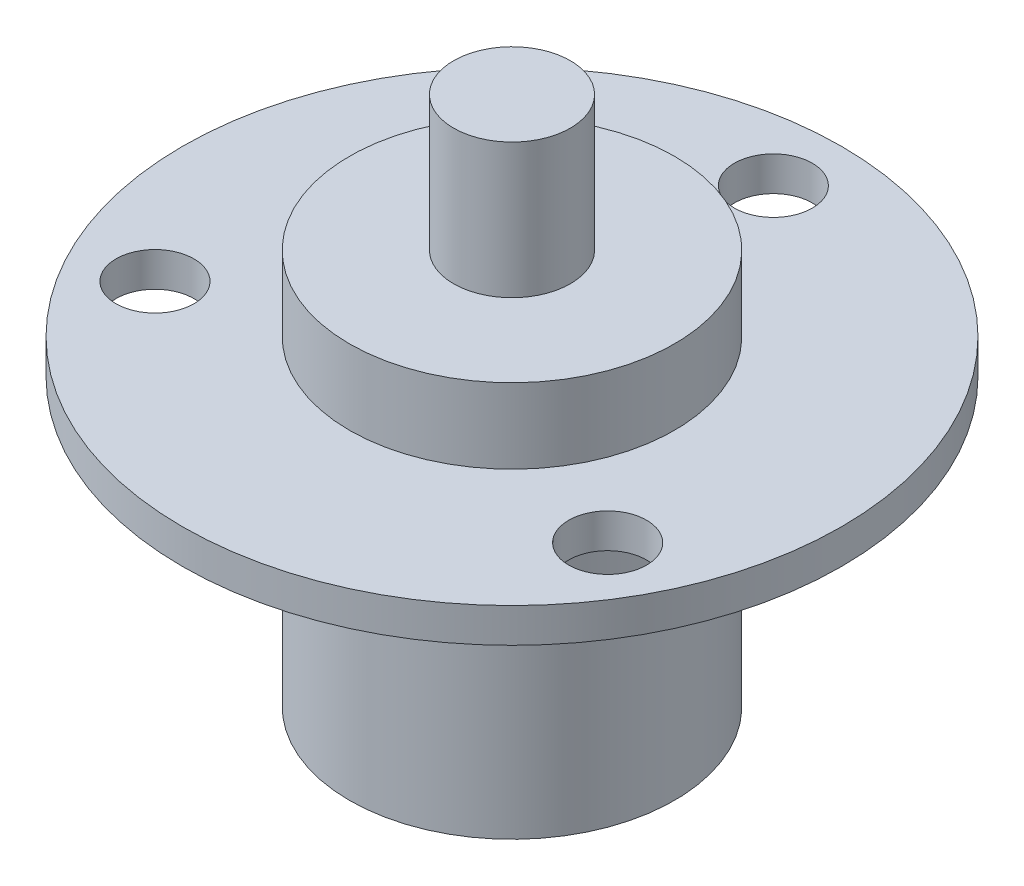
ISO-10303-21;
HEADER;
FILE_DESCRIPTION(('STEP AP214'),'2;1');
FILE_NAME('part.step','',(''),(''),'','','');
FILE_SCHEMA(('AUTOMOTIVE_DESIGN { 1 0 10303 214 1 1 1 1 }'));
ENDSEC;
DATA;
#1=APPLICATION_CONTEXT('core data for automotive mechanical design processes');
#2=APPLICATION_PROTOCOL_DEFINITION('international standard','automotive_design',2000,#1);
#3=PRODUCT_CONTEXT('',#1,'mechanical');
#4=PRODUCT('Part','Part','',(#3));
#5=PRODUCT_RELATED_PRODUCT_CATEGORY('part','',(#4));
#6=PRODUCT_DEFINITION_FORMATION('','',#4);
#7=PRODUCT_DEFINITION_CONTEXT('part definition',#1,'design');
#8=PRODUCT_DEFINITION('design','',#6,#7);
#9=PRODUCT_DEFINITION_SHAPE('','',#8);
#10=(LENGTH_UNIT() NAMED_UNIT(*) SI_UNIT(.MILLI.,.METRE.));
#11=(NAMED_UNIT(*) PLANE_ANGLE_UNIT() SI_UNIT($,.RADIAN.));
#12=(NAMED_UNIT(*) SI_UNIT($,.STERADIAN.) SOLID_ANGLE_UNIT());
#13=UNCERTAINTY_MEASURE_WITH_UNIT(LENGTH_MEASURE(1.E-05),#10,'distance_accuracy_value','');
#14=(GEOMETRIC_REPRESENTATION_CONTEXT(3) GLOBAL_UNCERTAINTY_ASSIGNED_CONTEXT((#13)) GLOBAL_UNIT_ASSIGNED_CONTEXT((#10,
#11,#12)) REPRESENTATION_CONTEXT('',''));
#15=CARTESIAN_POINT('',(0.,0.,0.));
#16=DIRECTION('',(0.,0.,1.));
#17=DIRECTION('',(1.,0.,0.));
#18=AXIS2_PLACEMENT_3D('',#15,#16,#17);
#19=CARTESIAN_POINT('',(0.,2.3,0.));
#20=DIRECTION('',(0.,-1.,0.));
#21=DIRECTION('',(0.,0.,-1.));
#22=AXIS2_PLACEMENT_3D('',#19,#20,#21);
#23=CYLINDRICAL_SURFACE('',#22,22.);
#24=CARTESIAN_POINT('',(0.,2.3,0.));
#25=DIRECTION('',(0.,1.,0.));
#26=DIRECTION('',(0.,0.,1.));
#27=AXIS2_PLACEMENT_3D('',#24,#25,#26);
#28=CIRCLE('',#27,22.);
#29=CARTESIAN_POINT('',(0.,2.3,22.));
#30=VERTEX_POINT('',#29);
#31=EDGE_CURVE('E51',#30,#30,#28,.T.);
#32=ORIENTED_EDGE('',*,*,#31,.F.);
#33=EDGE_LOOP('',(#32));
#34=FACE_BOUND('',#33,.T.);
#35=CARTESIAN_POINT('',(0.,0.,0.));
#36=DIRECTION('',(0.,1.,0.));
#37=DIRECTION('',(0.,0.,1.));
#38=AXIS2_PLACEMENT_3D('',#35,#36,#37);
#39=CIRCLE('',#38,22.);
#40=CARTESIAN_POINT('',(0.,0.,22.));
#41=VERTEX_POINT('',#40);
#42=EDGE_CURVE('E66',#41,#41,#39,.T.);
#43=ORIENTED_EDGE('',*,*,#42,.T.);
#44=EDGE_LOOP('',(#43));
#45=FACE_BOUND('',#44,.T.);
#46=ADVANCED_FACE('F39',(#34,#45),#23,.T.);
#47=CARTESIAN_POINT('',(0.,2.3,0.));
#48=DIRECTION('',(0.,1.,0.));
#49=DIRECTION('',(0.,0.,1.));
#50=AXIS2_PLACEMENT_3D('',#47,#48,#49);
#51=PLANE('',#50);
#52=CARTESIAN_POINT('',(-15.1121432960384,2.3,8.72500000000007));
#53=DIRECTION('',(0.,1.,0.));
#54=DIRECTION('',(0.,0.,1.));
#55=AXIS2_PLACEMENT_3D('',#52,#53,#54);
#56=CIRCLE('',#55,2.6);
#57=CARTESIAN_POINT('',(-15.1121432960384,2.3,11.3250000000001));
#58=VERTEX_POINT('',#57);
#59=EDGE_CURVE('E74',#58,#58,#56,.T.);
#60=ORIENTED_EDGE('',*,*,#59,.F.);
#61=EDGE_LOOP('',(#60));
#62=FACE_BOUND('',#61,.T.);
#63=CARTESIAN_POINT('',(15.1121432960384,2.3,8.72500000000007));
#64=DIRECTION('',(0.,1.,0.));
#65=DIRECTION('',(0.,0.,1.));
#66=AXIS2_PLACEMENT_3D('',#63,#64,#65);
#67=CIRCLE('',#66,2.6);
#68=CARTESIAN_POINT('',(15.1121432960384,2.3,11.3250000000001));
#69=VERTEX_POINT('',#68);
#70=EDGE_CURVE('E204',#69,#69,#67,.T.);
#71=ORIENTED_EDGE('',*,*,#70,.F.);
#72=EDGE_LOOP('',(#71));
#73=FACE_BOUND('',#72,.T.);
#74=CARTESIAN_POINT('',(0.,2.3,-17.45));
#75=DIRECTION('',(0.,1.,0.));
#76=DIRECTION('',(0.,0.,1.));
#77=AXIS2_PLACEMENT_3D('',#74,#75,#76);
#78=CIRCLE('',#77,2.6);
#79=CARTESIAN_POINT('',(0.,2.3,-14.85));
#80=VERTEX_POINT('',#79);
#81=EDGE_CURVE('E207',#80,#80,#78,.T.);
#82=ORIENTED_EDGE('',*,*,#81,.F.);
#83=EDGE_LOOP('',(#82));
#84=FACE_BOUND('',#83,.T.);
#85=CARTESIAN_POINT('',(0.,2.3,0.));
#86=DIRECTION('',(0.,1.,0.));
#87=DIRECTION('',(0.,0.,1.));
#88=AXIS2_PLACEMENT_3D('',#85,#86,#87);
#89=CIRCLE('',#88,10.85);
#90=CARTESIAN_POINT('',(0.,2.3,10.85));
#91=VERTEX_POINT('',#90);
#92=EDGE_CURVE('E46',#91,#91,#89,.T.);
#93=ORIENTED_EDGE('',*,*,#92,.F.);
#94=EDGE_LOOP('',(#93));
#95=FACE_BOUND('',#94,.T.);
#96=ORIENTED_EDGE('',*,*,#31,.T.);
#97=EDGE_LOOP('',(#96));
#98=FACE_BOUND('',#97,.T.);
#99=ADVANCED_FACE('F100',(#62,#73,#84,#95,#98),#51,.T.);
#100=CARTESIAN_POINT('',(0.,0.,0.));
#101=DIRECTION('',(0.,1.,0.));
#102=DIRECTION('',(0.,0.,1.));
#103=AXIS2_PLACEMENT_3D('',#100,#101,#102);
#104=PLANE('',#103);
#105=CARTESIAN_POINT('',(-15.1121432960384,0.,8.72500000000007));
#106=DIRECTION('',(0.,1.,0.));
#107=DIRECTION('',(0.,0.,1.));
#108=AXIS2_PLACEMENT_3D('',#105,#106,#107);
#109=CIRCLE('',#108,2.6);
#110=CARTESIAN_POINT('',(-15.1121432960384,0.,11.3250000000001));
#111=VERTEX_POINT('',#110);
#112=EDGE_CURVE('E42',#111,#111,#109,.T.);
#113=ORIENTED_EDGE('',*,*,#112,.T.);
#114=EDGE_LOOP('',(#113));
#115=FACE_BOUND('',#114,.T.);
#116=CARTESIAN_POINT('',(15.1121432960384,0.,8.72500000000007));
#117=DIRECTION('',(0.,1.,0.));
#118=DIRECTION('',(0.,0.,1.));
#119=AXIS2_PLACEMENT_3D('',#116,#117,#118);
#120=CIRCLE('',#119,2.6);
#121=CARTESIAN_POINT('',(15.1121432960384,0.,11.3250000000001));
#122=VERTEX_POINT('',#121);
#123=EDGE_CURVE('E73',#122,#122,#120,.T.);
#124=ORIENTED_EDGE('',*,*,#123,.T.);
#125=EDGE_LOOP('',(#124));
#126=FACE_BOUND('',#125,.T.);
#127=CARTESIAN_POINT('',(0.,0.,-17.45));
#128=DIRECTION('',(0.,1.,0.));
#129=DIRECTION('',(0.,0.,1.));
#130=AXIS2_PLACEMENT_3D('',#127,#128,#129);
#131=CIRCLE('',#130,2.6);
#132=CARTESIAN_POINT('',(0.,0.,-14.85));
#133=VERTEX_POINT('',#132);
#134=EDGE_CURVE('E71',#133,#133,#131,.T.);
#135=ORIENTED_EDGE('',*,*,#134,.T.);
#136=EDGE_LOOP('',(#135));
#137=FACE_BOUND('',#136,.T.);
#138=CARTESIAN_POINT('',(0.,0.,0.));
#139=DIRECTION('',(0.,1.,0.));
#140=DIRECTION('',(0.,0.,1.));
#141=AXIS2_PLACEMENT_3D('',#138,#139,#140);
#142=CIRCLE('',#141,10.85);
#143=CARTESIAN_POINT('',(0.,0.,10.85));
#144=VERTEX_POINT('',#143);
#145=EDGE_CURVE('E62',#144,#144,#142,.T.);
#146=ORIENTED_EDGE('',*,*,#145,.T.);
#147=EDGE_LOOP('',(#146));
#148=FACE_BOUND('',#147,.T.);
#149=ORIENTED_EDGE('',*,*,#42,.F.);
#150=EDGE_LOOP('',(#149));
#151=FACE_BOUND('',#150,.T.);
#152=ADVANCED_FACE('F106',(#115,#126,#137,#148,#151),#104,.F.);
#153=CARTESIAN_POINT('',(0.,-19.1,0.));
#154=DIRECTION('',(0.,1.,0.));
#155=DIRECTION('',(0.,0.,1.));
#156=AXIS2_PLACEMENT_3D('',#153,#154,#155);
#157=PLANE('',#156);
#158=CARTESIAN_POINT('',(0.,-19.1,0.));
#159=DIRECTION('',(0.,1.,0.));
#160=DIRECTION('',(0.,0.,1.));
#161=AXIS2_PLACEMENT_3D('',#158,#159,#160);
#162=CIRCLE('',#161,10.85);
#163=CARTESIAN_POINT('',(0.,-19.1,10.85));
#164=VERTEX_POINT('',#163);
#165=EDGE_CURVE('E60',#164,#164,#162,.T.);
#166=ORIENTED_EDGE('',*,*,#165,.F.);
#167=EDGE_LOOP('',(#166));
#168=FACE_BOUND('',#167,.T.);
#169=ADVANCED_FACE('F114',(#168),#157,.F.);
#170=CARTESIAN_POINT('',(0.,-19.1,0.));
#171=DIRECTION('',(0.,1.,0.));
#172=DIRECTION('',(0.,0.,1.));
#173=AXIS2_PLACEMENT_3D('',#170,#171,#172);
#174=CYLINDRICAL_SURFACE('',#173,10.85);
#175=ORIENTED_EDGE('',*,*,#165,.T.);
#176=EDGE_LOOP('',(#175));
#177=FACE_BOUND('',#176,.T.);
#178=ORIENTED_EDGE('',*,*,#145,.F.);
#179=EDGE_LOOP('',(#178));
#180=FACE_BOUND('',#179,.T.);
#181=ADVANCED_FACE('F118',(#177,#180),#174,.T.);
#182=ORIENTED_EDGE('',*,*,#92,.T.);
#183=EDGE_LOOP('',(#182));
#184=FACE_BOUND('',#183,.T.);
#185=CARTESIAN_POINT('',(0.,7.3,0.));
#186=DIRECTION('',(0.,1.,0.));
#187=DIRECTION('',(0.,0.,1.));
#188=AXIS2_PLACEMENT_3D('',#185,#186,#187);
#189=CIRCLE('',#188,10.85);
#190=CARTESIAN_POINT('',(0.,7.3,10.85));
#191=VERTEX_POINT('',#190);
#192=EDGE_CURVE('E57',#191,#191,#189,.T.);
#193=ORIENTED_EDGE('',*,*,#192,.F.);
#194=EDGE_LOOP('',(#193));
#195=FACE_BOUND('',#194,.T.);
#196=ADVANCED_FACE('F96',(#184,#195),#174,.T.);
#197=CARTESIAN_POINT('',(0.,7.3,0.));
#198=DIRECTION('',(0.,1.,0.));
#199=DIRECTION('',(0.,0.,1.));
#200=AXIS2_PLACEMENT_3D('',#197,#198,#199);
#201=PLANE('',#200);
#202=CARTESIAN_POINT('',(0.,7.3,0.));
#203=DIRECTION('',(0.,1.,0.));
#204=DIRECTION('',(0.,0.,1.));
#205=AXIS2_PLACEMENT_3D('',#202,#203,#204);
#206=CIRCLE('',#205,3.9);
#207=CARTESIAN_POINT('',(0.,7.3,3.9));
#208=VERTEX_POINT('',#207);
#209=EDGE_CURVE('E10',#208,#208,#206,.T.);
#210=ORIENTED_EDGE('',*,*,#209,.F.);
#211=EDGE_LOOP('',(#210));
#212=FACE_BOUND('',#211,.T.);
#213=ORIENTED_EDGE('',*,*,#192,.T.);
#214=EDGE_LOOP('',(#213));
#215=FACE_BOUND('',#214,.T.);
#216=ADVANCED_FACE('F88',(#212,#215),#201,.T.);
#217=CARTESIAN_POINT('',(0.,16.3,0.));
#218=DIRECTION('',(0.,-1.,0.));
#219=DIRECTION('',(0.,0.,-1.));
#220=AXIS2_PLACEMENT_3D('',#217,#218,#219);
#221=CYLINDRICAL_SURFACE('',#220,3.9);
#222=CARTESIAN_POINT('',(0.,16.3,0.));
#223=DIRECTION('',(0.,1.,0.));
#224=DIRECTION('',(0.,0.,1.));
#225=AXIS2_PLACEMENT_3D('',#222,#223,#224);
#226=CIRCLE('',#225,3.9);
#227=CARTESIAN_POINT('',(0.,16.3,3.9));
#228=VERTEX_POINT('',#227);
#229=EDGE_CURVE('E55',#228,#228,#226,.T.);
#230=ORIENTED_EDGE('',*,*,#229,.F.);
#231=EDGE_LOOP('',(#230));
#232=FACE_BOUND('',#231,.T.);
#233=ORIENTED_EDGE('',*,*,#209,.T.);
#234=EDGE_LOOP('',(#233));
#235=FACE_BOUND('',#234,.T.);
#236=ADVANCED_FACE('F86',(#232,#235),#221,.T.);
#237=CARTESIAN_POINT('',(0.,16.3,0.));
#238=DIRECTION('',(0.,1.,0.));
#239=DIRECTION('',(0.,0.,1.));
#240=AXIS2_PLACEMENT_3D('',#237,#238,#239);
#241=PLANE('',#240);
#242=ORIENTED_EDGE('',*,*,#229,.T.);
#243=EDGE_LOOP('',(#242));
#244=FACE_BOUND('',#243,.T.);
#245=ADVANCED_FACE('F84',(#244),#241,.T.);
#246=CARTESIAN_POINT('',(0.,-19.1,-17.45));
#247=DIRECTION('',(0.,1.,0.));
#248=DIRECTION('',(0.,0.,1.));
#249=AXIS2_PLACEMENT_3D('',#246,#247,#248);
#250=CYLINDRICAL_SURFACE('',#249,2.6);
#251=ORIENTED_EDGE('',*,*,#81,.T.);
#252=EDGE_LOOP('',(#251));
#253=FACE_BOUND('',#252,.T.);
#254=ORIENTED_EDGE('',*,*,#134,.F.);
#255=EDGE_LOOP('',(#254));
#256=FACE_BOUND('',#255,.T.);
#257=ADVANCED_FACE('F94',(#253,#256),#250,.F.);
#258=CARTESIAN_POINT('',(15.1121432960384,-19.1,8.72500000000007));
#259=DIRECTION('',(0.,1.,0.));
#260=DIRECTION('',(0.,0.,1.));
#261=AXIS2_PLACEMENT_3D('',#258,#259,#260);
#262=CYLINDRICAL_SURFACE('',#261,2.6);
#263=ORIENTED_EDGE('',*,*,#70,.T.);
#264=EDGE_LOOP('',(#263));
#265=FACE_BOUND('',#264,.T.);
#266=ORIENTED_EDGE('',*,*,#123,.F.);
#267=EDGE_LOOP('',(#266));
#268=FACE_BOUND('',#267,.T.);
#269=ADVANCED_FACE('F178',(#265,#268),#262,.F.);
#270=CARTESIAN_POINT('',(-15.1121432960384,-19.1,8.72500000000007));
#271=DIRECTION('',(0.,1.,0.));
#272=DIRECTION('',(0.,0.,1.));
#273=AXIS2_PLACEMENT_3D('',#270,#271,#272);
#274=CYLINDRICAL_SURFACE('',#273,2.6);
#275=ORIENTED_EDGE('',*,*,#59,.T.);
#276=EDGE_LOOP('',(#275));
#277=FACE_BOUND('',#276,.T.);
#278=ORIENTED_EDGE('',*,*,#112,.F.);
#279=EDGE_LOOP('',(#278));
#280=FACE_BOUND('',#279,.T.);
#281=ADVANCED_FACE('F188',(#277,#280),#274,.F.);
#282=CLOSED_SHELL('',(#46,#99,#152,#169,#181,#196,#216,#236,#245,#257,#269,#281));
#283=MANIFOLD_SOLID_BREP('B2',#282);
#284=ADVANCED_BREP_SHAPE_REPRESENTATION('',(#18,#283),#14);
#285=SHAPE_DEFINITION_REPRESENTATION(#9,#284);
ENDSEC;
END-ISO-10303-21;
